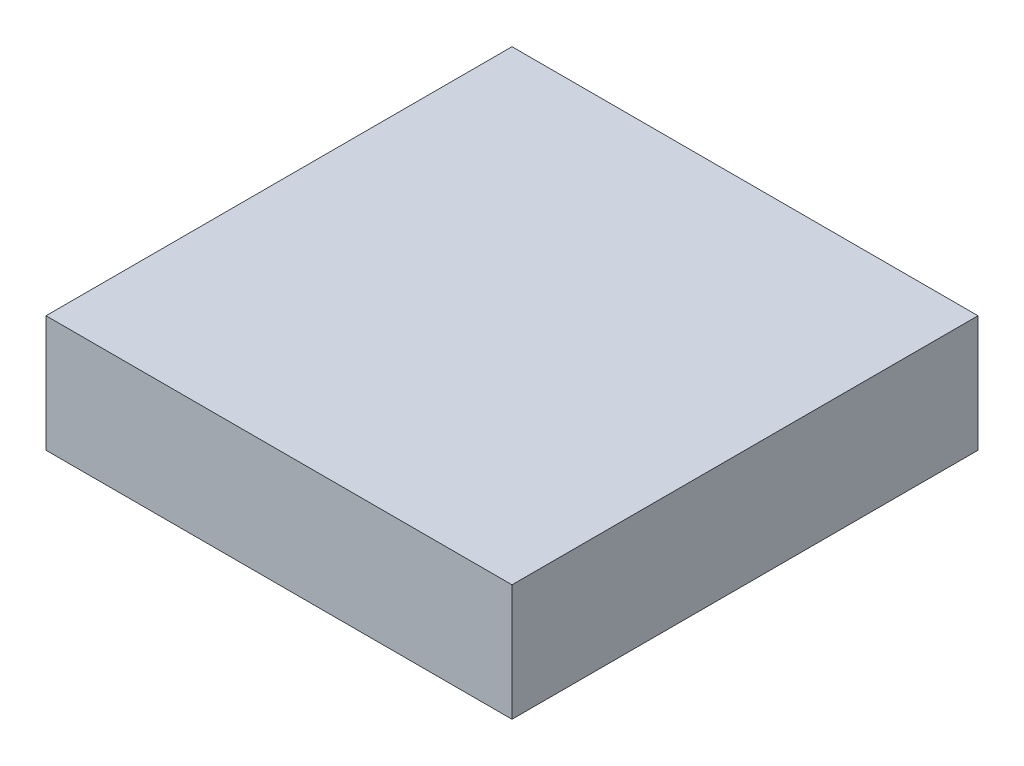
ISO-10303-21;
HEADER;
FILE_DESCRIPTION(('STEP AP214'),'2;1');
FILE_NAME('part.step','',(''),(''),'','','');
FILE_SCHEMA(('AUTOMOTIVE_DESIGN { 1 0 10303 214 1 1 1 1 }'));
ENDSEC;
DATA;
#1=APPLICATION_CONTEXT('core data for automotive mechanical design processes');
#2=APPLICATION_PROTOCOL_DEFINITION('international standard','automotive_design',2000,#1);
#3=PRODUCT_CONTEXT('',#1,'mechanical');
#4=PRODUCT('Part','Part','',(#3));
#5=PRODUCT_RELATED_PRODUCT_CATEGORY('part','',(#4));
#6=PRODUCT_DEFINITION_FORMATION('','',#4);
#7=PRODUCT_DEFINITION_CONTEXT('part definition',#1,'design');
#8=PRODUCT_DEFINITION('design','',#6,#7);
#9=PRODUCT_DEFINITION_SHAPE('','',#8);
#10=(LENGTH_UNIT() NAMED_UNIT(*) SI_UNIT(.MILLI.,.METRE.));
#11=(NAMED_UNIT(*) PLANE_ANGLE_UNIT() SI_UNIT($,.RADIAN.));
#12=(NAMED_UNIT(*) SI_UNIT($,.STERADIAN.) SOLID_ANGLE_UNIT());
#13=UNCERTAINTY_MEASURE_WITH_UNIT(LENGTH_MEASURE(1.E-05),#10,'distance_accuracy_value','');
#14=(GEOMETRIC_REPRESENTATION_CONTEXT(3) GLOBAL_UNCERTAINTY_ASSIGNED_CONTEXT((#13)) GLOBAL_UNIT_ASSIGNED_CONTEXT((#10,
#11,#12)) REPRESENTATION_CONTEXT('',''));
#15=CARTESIAN_POINT('',(0.,0.,0.));
#16=DIRECTION('',(0.,0.,1.));
#17=DIRECTION('',(1.,0.,0.));
#18=AXIS2_PLACEMENT_3D('',#15,#16,#17);
#19=CARTESIAN_POINT('',(0.,5.,0.));
#20=DIRECTION('',(1.,0.,0.));
#21=DIRECTION('',(0.,0.,-1.));
#22=AXIS2_PLACEMENT_3D('',#19,#20,#21);
#23=PLANE('',#22);
#24=DIRECTION('',(0.,0.,1.));
#25=VECTOR('',#24,1.);
#26=CARTESIAN_POINT('',(0.,0.,0.));
#27=LINE('',#26,#25);
#28=CARTESIAN_POINT('',(0.,0.,-20.));
#29=VERTEX_POINT('',#28);
#30=CARTESIAN_POINT('',(0.,0.,0.));
#31=VERTEX_POINT('',#30);
#32=EDGE_CURVE('E113',#29,#31,#27,.T.);
#33=ORIENTED_EDGE('',*,*,#32,.T.);
#34=DIRECTION('',(0.,-1.,0.));
#35=VECTOR('',#34,1.);
#36=CARTESIAN_POINT('',(0.,5.,0.));
#37=LINE('',#36,#35);
#38=CARTESIAN_POINT('',(0.,5.,0.));
#39=VERTEX_POINT('',#38);
#40=EDGE_CURVE('E11',#39,#31,#37,.T.);
#41=ORIENTED_EDGE('',*,*,#40,.F.);
#42=DIRECTION('',(0.,0.,1.));
#43=VECTOR('',#42,1.);
#44=CARTESIAN_POINT('',(0.,5.,0.));
#45=LINE('',#44,#43);
#46=CARTESIAN_POINT('',(0.,5.,-20.));
#47=VERTEX_POINT('',#46);
#48=EDGE_CURVE('E97',#47,#39,#45,.T.);
#49=ORIENTED_EDGE('',*,*,#48,.F.);
#50=DIRECTION('',(0.,-1.,0.));
#51=VECTOR('',#50,1.);
#52=CARTESIAN_POINT('',(0.,5.,-20.));
#53=LINE('',#52,#51);
#54=EDGE_CURVE('E109',#47,#29,#53,.T.);
#55=ORIENTED_EDGE('',*,*,#54,.T.);
#56=EDGE_LOOP('',(#33,#41,#49,#55));
#57=FACE_BOUND('',#56,.T.);
#58=ADVANCED_FACE('F45',(#57),#23,.F.);
#59=CARTESIAN_POINT('',(0.,5.,0.));
#60=DIRECTION('',(0.,0.,-1.));
#61=DIRECTION('',(-1.,0.,0.));
#62=AXIS2_PLACEMENT_3D('',#59,#60,#61);
#63=PLANE('',#62);
#64=DIRECTION('',(1.,0.,0.));
#65=VECTOR('',#64,1.);
#66=CARTESIAN_POINT('',(0.,0.,0.));
#67=LINE('',#66,#65);
#68=CARTESIAN_POINT('',(20.,0.,0.));
#69=VERTEX_POINT('',#68);
#70=EDGE_CURVE('E102',#31,#69,#67,.T.);
#71=ORIENTED_EDGE('',*,*,#70,.T.);
#72=DIRECTION('',(0.,-1.,0.));
#73=VECTOR('',#72,1.);
#74=CARTESIAN_POINT('',(20.,5.,0.));
#75=LINE('',#74,#73);
#76=CARTESIAN_POINT('',(20.,5.,0.));
#77=VERTEX_POINT('',#76);
#78=EDGE_CURVE('E54',#77,#69,#75,.T.);
#79=ORIENTED_EDGE('',*,*,#78,.F.);
#80=DIRECTION('',(1.,0.,0.));
#81=VECTOR('',#80,1.);
#82=CARTESIAN_POINT('',(0.,5.,0.));
#83=LINE('',#82,#81);
#84=EDGE_CURVE('E92',#39,#77,#83,.T.);
#85=ORIENTED_EDGE('',*,*,#84,.F.);
#86=ORIENTED_EDGE('',*,*,#40,.T.);
#87=EDGE_LOOP('',(#71,#79,#85,#86));
#88=FACE_BOUND('',#87,.T.);
#89=ADVANCED_FACE('F101',(#88),#63,.F.);
#90=CARTESIAN_POINT('',(20.,5.,0.));
#91=DIRECTION('',(-1.,0.,0.));
#92=DIRECTION('',(0.,0.,1.));
#93=AXIS2_PLACEMENT_3D('',#90,#91,#92);
#94=PLANE('',#93);
#95=DIRECTION('',(0.,0.,-1.));
#96=VECTOR('',#95,1.);
#97=CARTESIAN_POINT('',(20.,0.,0.));
#98=LINE('',#97,#96);
#99=CARTESIAN_POINT('',(20.,0.,-20.));
#100=VERTEX_POINT('',#99);
#101=EDGE_CURVE('E79',#69,#100,#98,.T.);
#102=ORIENTED_EDGE('',*,*,#101,.T.);
#103=DIRECTION('',(0.,-1.,0.));
#104=VECTOR('',#103,1.);
#105=CARTESIAN_POINT('',(20.,5.,-20.));
#106=LINE('',#105,#104);
#107=CARTESIAN_POINT('',(20.,5.,-20.));
#108=VERTEX_POINT('',#107);
#109=EDGE_CURVE('E104',#108,#100,#106,.T.);
#110=ORIENTED_EDGE('',*,*,#109,.F.);
#111=DIRECTION('',(0.,0.,-1.));
#112=VECTOR('',#111,1.);
#113=CARTESIAN_POINT('',(20.,5.,0.));
#114=LINE('',#113,#112);
#115=EDGE_CURVE('E95',#77,#108,#114,.T.);
#116=ORIENTED_EDGE('',*,*,#115,.F.);
#117=ORIENTED_EDGE('',*,*,#78,.T.);
#118=EDGE_LOOP('',(#102,#110,#116,#117));
#119=FACE_BOUND('',#118,.T.);
#120=ADVANCED_FACE('F105',(#119),#94,.F.);
#121=CARTESIAN_POINT('',(0.,5.,-20.));
#122=DIRECTION('',(0.,0.,1.));
#123=DIRECTION('',(1.,0.,0.));
#124=AXIS2_PLACEMENT_3D('',#121,#122,#123);
#125=PLANE('',#124);
#126=DIRECTION('',(-1.,0.,0.));
#127=VECTOR('',#126,1.);
#128=CARTESIAN_POINT('',(0.,0.,-20.));
#129=LINE('',#128,#127);
#130=EDGE_CURVE('E85',#100,#29,#129,.T.);
#131=ORIENTED_EDGE('',*,*,#130,.T.);
#132=ORIENTED_EDGE('',*,*,#54,.F.);
#133=DIRECTION('',(-1.,0.,0.));
#134=VECTOR('',#133,1.);
#135=CARTESIAN_POINT('',(0.,5.,-20.));
#136=LINE('',#135,#134);
#137=EDGE_CURVE('E62',#108,#47,#136,.T.);
#138=ORIENTED_EDGE('',*,*,#137,.F.);
#139=ORIENTED_EDGE('',*,*,#109,.T.);
#140=EDGE_LOOP('',(#131,#132,#138,#139));
#141=FACE_BOUND('',#140,.T.);
#142=ADVANCED_FACE('F126',(#141),#125,.F.);
#143=CARTESIAN_POINT('',(0.,5.,0.));
#144=DIRECTION('',(0.,-1.,0.));
#145=DIRECTION('',(0.,0.,-1.));
#146=AXIS2_PLACEMENT_3D('',#143,#144,#145);
#147=PLANE('',#146);
#148=ORIENTED_EDGE('',*,*,#48,.T.);
#149=ORIENTED_EDGE('',*,*,#84,.T.);
#150=ORIENTED_EDGE('',*,*,#115,.T.);
#151=ORIENTED_EDGE('',*,*,#137,.T.);
#152=EDGE_LOOP('',(#148,#149,#150,#151));
#153=FACE_BOUND('',#152,.T.);
#154=ADVANCED_FACE('F93',(#153),#147,.F.);
#155=CARTESIAN_POINT('',(0.,0.,0.));
#156=DIRECTION('',(0.,-1.,0.));
#157=DIRECTION('',(0.,0.,-1.));
#158=AXIS2_PLACEMENT_3D('',#155,#156,#157);
#159=PLANE('',#158);
#160=ORIENTED_EDGE('',*,*,#32,.F.);
#161=ORIENTED_EDGE('',*,*,#130,.F.);
#162=ORIENTED_EDGE('',*,*,#101,.F.);
#163=ORIENTED_EDGE('',*,*,#70,.F.);
#164=EDGE_LOOP('',(#160,#161,#162,#163));
#165=FACE_BOUND('',#164,.T.);
#166=ADVANCED_FACE('F129',(#165),#159,.T.);
#167=CLOSED_SHELL('',(#58,#89,#120,#142,#154,#166));
#168=MANIFOLD_SOLID_BREP('B2',#167);
#169=ADVANCED_BREP_SHAPE_REPRESENTATION('',(#18,#168),#14);
#170=SHAPE_DEFINITION_REPRESENTATION(#9,#169);
ENDSEC;
END-ISO-10303-21;
